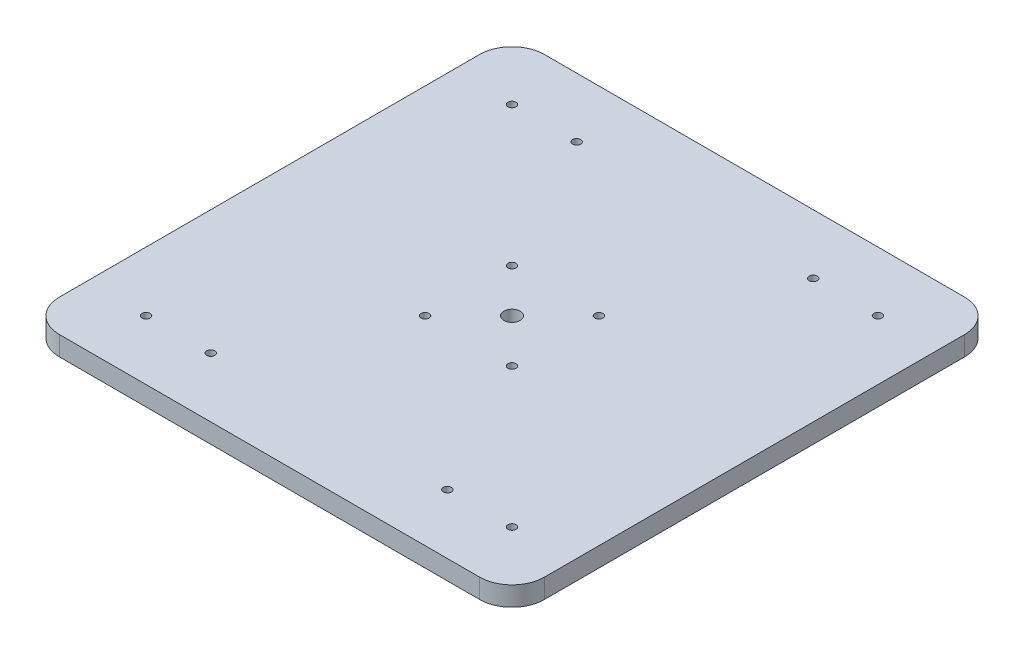
ISO-10303-21;
HEADER;
FILE_DESCRIPTION(('STEP AP214'),'2;1');
FILE_NAME('part.step','',(''),(''),'','','');
FILE_SCHEMA(('AUTOMOTIVE_DESIGN { 1 0 10303 214 1 1 1 1 }'));
ENDSEC;
DATA;
#1=APPLICATION_CONTEXT('core data for automotive mechanical design processes');
#2=APPLICATION_PROTOCOL_DEFINITION('international standard','automotive_design',2000,#1);
#3=PRODUCT_CONTEXT('',#1,'mechanical');
#4=PRODUCT('Part','Part','',(#3));
#5=PRODUCT_RELATED_PRODUCT_CATEGORY('part','',(#4));
#6=PRODUCT_DEFINITION_FORMATION('','',#4);
#7=PRODUCT_DEFINITION_CONTEXT('part definition',#1,'design');
#8=PRODUCT_DEFINITION('design','',#6,#7);
#9=PRODUCT_DEFINITION_SHAPE('','',#8);
#10=(LENGTH_UNIT() NAMED_UNIT(*) SI_UNIT(.MILLI.,.METRE.));
#11=(NAMED_UNIT(*) PLANE_ANGLE_UNIT() SI_UNIT($,.RADIAN.));
#12=(NAMED_UNIT(*) SI_UNIT($,.STERADIAN.) SOLID_ANGLE_UNIT());
#13=UNCERTAINTY_MEASURE_WITH_UNIT(LENGTH_MEASURE(1.E-05),#10,'distance_accuracy_value','');
#14=(GEOMETRIC_REPRESENTATION_CONTEXT(3) GLOBAL_UNCERTAINTY_ASSIGNED_CONTEXT((#13)) GLOBAL_UNIT_ASSIGNED_CONTEXT((#10,
#11,#12)) REPRESENTATION_CONTEXT('',''));
#15=CARTESIAN_POINT('',(0.,0.,0.));
#16=DIRECTION('',(0.,0.,1.));
#17=DIRECTION('',(1.,0.,0.));
#18=AXIS2_PLACEMENT_3D('',#15,#16,#17);
#19=CARTESIAN_POINT('',(75.,6.,-75.));
#20=DIRECTION('',(-1.,0.,0.));
#21=DIRECTION('',(0.,0.,1.));
#22=AXIS2_PLACEMENT_3D('',#19,#20,#21);
#23=PLANE('',#22);
#24=DIRECTION('',(0.,0.,-1.));
#25=VECTOR('',#24,1.);
#26=CARTESIAN_POINT('',(75.,6.,-75.));
#27=LINE('',#26,#25);
#28=CARTESIAN_POINT('',(75.,6.,65.));
#29=VERTEX_POINT('',#28);
#30=CARTESIAN_POINT('',(75.,6.,-65.));
#31=VERTEX_POINT('',#30);
#32=EDGE_CURVE('E147',#29,#31,#27,.T.);
#33=ORIENTED_EDGE('',*,*,#32,.F.);
#34=DIRECTION('',(0.,-1.,0.));
#35=VECTOR('',#34,1.);
#36=CARTESIAN_POINT('',(75.,6.,65.));
#37=LINE('',#36,#35);
#38=CARTESIAN_POINT('',(75.,0.,65.));
#39=VERTEX_POINT('',#38);
#40=EDGE_CURVE('E187',#29,#39,#37,.T.);
#41=ORIENTED_EDGE('',*,*,#40,.T.);
#42=DIRECTION('',(0.,0.,-1.));
#43=VECTOR('',#42,1.);
#44=CARTESIAN_POINT('',(75.,0.,-75.));
#45=LINE('',#44,#43);
#46=CARTESIAN_POINT('',(75.,0.,-65.));
#47=VERTEX_POINT('',#46);
#48=EDGE_CURVE('E212',#39,#47,#45,.T.);
#49=ORIENTED_EDGE('',*,*,#48,.T.);
#50=DIRECTION('',(0.,-1.,0.));
#51=VECTOR('',#50,1.);
#52=CARTESIAN_POINT('',(75.,6.,-65.));
#53=LINE('',#52,#51);
#54=EDGE_CURVE('E184',#47,#31,#53,.F.);
#55=ORIENTED_EDGE('',*,*,#54,.T.);
#56=EDGE_LOOP('',(#33,#41,#49,#55));
#57=FACE_BOUND('',#56,.T.);
#58=ADVANCED_FACE('F51',(#57),#23,.F.);
#59=CARTESIAN_POINT('',(-75.,6.,-75.));
#60=DIRECTION('',(0.,0.,1.));
#61=DIRECTION('',(1.,0.,0.));
#62=AXIS2_PLACEMENT_3D('',#59,#60,#61);
#63=PLANE('',#62);
#64=DIRECTION('',(-1.,0.,0.));
#65=VECTOR('',#64,1.);
#66=CARTESIAN_POINT('',(-75.,6.,-75.));
#67=LINE('',#66,#65);
#68=CARTESIAN_POINT('',(65.,6.,-75.));
#69=VERTEX_POINT('',#68);
#70=CARTESIAN_POINT('',(-65.,6.,-75.));
#71=VERTEX_POINT('',#70);
#72=EDGE_CURVE('E152',#69,#71,#67,.T.);
#73=ORIENTED_EDGE('',*,*,#72,.F.);
#74=DIRECTION('',(0.,-1.,0.));
#75=VECTOR('',#74,1.);
#76=CARTESIAN_POINT('',(65.,6.,-75.));
#77=LINE('',#76,#75);
#78=CARTESIAN_POINT('',(65.,0.,-75.));
#79=VERTEX_POINT('',#78);
#80=EDGE_CURVE('E11',#69,#79,#77,.T.);
#81=ORIENTED_EDGE('',*,*,#80,.T.);
#82=DIRECTION('',(-1.,0.,0.));
#83=VECTOR('',#82,1.);
#84=CARTESIAN_POINT('',(-75.,0.,-75.));
#85=LINE('',#84,#83);
#86=CARTESIAN_POINT('',(-65.,0.,-75.));
#87=VERTEX_POINT('',#86);
#88=EDGE_CURVE('E155',#79,#87,#85,.T.);
#89=ORIENTED_EDGE('',*,*,#88,.T.);
#90=DIRECTION('',(0.,-1.,0.));
#91=VECTOR('',#90,1.);
#92=CARTESIAN_POINT('',(-65.,6.,-75.));
#93=LINE('',#92,#91);
#94=EDGE_CURVE('E60',#87,#71,#93,.F.);
#95=ORIENTED_EDGE('',*,*,#94,.T.);
#96=EDGE_LOOP('',(#73,#81,#89,#95));
#97=FACE_BOUND('',#96,.T.);
#98=ADVANCED_FACE('F356',(#97),#63,.F.);
#99=CARTESIAN_POINT('',(-75.,6.,-75.));
#100=DIRECTION('',(1.,0.,0.));
#101=DIRECTION('',(0.,0.,-1.));
#102=AXIS2_PLACEMENT_3D('',#99,#100,#101);
#103=PLANE('',#102);
#104=DIRECTION('',(0.,0.,1.));
#105=VECTOR('',#104,1.);
#106=CARTESIAN_POINT('',(-75.,0.,-75.));
#107=LINE('',#106,#105);
#108=CARTESIAN_POINT('',(-75.,0.,-65.));
#109=VERTEX_POINT('',#108);
#110=CARTESIAN_POINT('',(-75.,0.,65.));
#111=VERTEX_POINT('',#110);
#112=EDGE_CURVE('E148',#109,#111,#107,.T.);
#113=ORIENTED_EDGE('',*,*,#112,.T.);
#114=DIRECTION('',(0.,-1.,0.));
#115=VECTOR('',#114,1.);
#116=CARTESIAN_POINT('',(-75.,6.,65.));
#117=LINE('',#116,#115);
#118=CARTESIAN_POINT('',(-75.,6.,65.));
#119=VERTEX_POINT('',#118);
#120=EDGE_CURVE('E123',#111,#119,#117,.F.);
#121=ORIENTED_EDGE('',*,*,#120,.T.);
#122=DIRECTION('',(0.,0.,1.));
#123=VECTOR('',#122,1.);
#124=CARTESIAN_POINT('',(-75.,6.,-75.));
#125=LINE('',#124,#123);
#126=CARTESIAN_POINT('',(-75.,6.,-65.));
#127=VERTEX_POINT('',#126);
#128=EDGE_CURVE('E255',#127,#119,#125,.T.);
#129=ORIENTED_EDGE('',*,*,#128,.F.);
#130=DIRECTION('',(0.,-1.,0.));
#131=VECTOR('',#130,1.);
#132=CARTESIAN_POINT('',(-75.,6.,-65.));
#133=LINE('',#132,#131);
#134=EDGE_CURVE('E129',#127,#109,#133,.T.);
#135=ORIENTED_EDGE('',*,*,#134,.T.);
#136=EDGE_LOOP('',(#113,#121,#129,#135));
#137=FACE_BOUND('',#136,.T.);
#138=ADVANCED_FACE('F361',(#137),#103,.F.);
#139=CARTESIAN_POINT('',(-75.,6.,75.));
#140=DIRECTION('',(0.,0.,-1.));
#141=DIRECTION('',(-1.,0.,0.));
#142=AXIS2_PLACEMENT_3D('',#139,#140,#141);
#143=PLANE('',#142);
#144=DIRECTION('',(1.,0.,0.));
#145=VECTOR('',#144,1.);
#146=CARTESIAN_POINT('',(-75.,6.,75.));
#147=LINE('',#146,#145);
#148=CARTESIAN_POINT('',(-65.,6.,75.));
#149=VERTEX_POINT('',#148);
#150=CARTESIAN_POINT('',(65.,6.,75.));
#151=VERTEX_POINT('',#150);
#152=EDGE_CURVE('E139',#149,#151,#147,.T.);
#153=ORIENTED_EDGE('',*,*,#152,.F.);
#154=DIRECTION('',(0.,-1.,0.));
#155=VECTOR('',#154,1.);
#156=CARTESIAN_POINT('',(-65.,6.,75.));
#157=LINE('',#156,#155);
#158=CARTESIAN_POINT('',(-65.,0.,75.));
#159=VERTEX_POINT('',#158);
#160=EDGE_CURVE('E122',#149,#159,#157,.T.);
#161=ORIENTED_EDGE('',*,*,#160,.T.);
#162=DIRECTION('',(1.,0.,0.));
#163=VECTOR('',#162,1.);
#164=CARTESIAN_POINT('',(-75.,0.,75.));
#165=LINE('',#164,#163);
#166=CARTESIAN_POINT('',(65.,0.,75.));
#167=VERTEX_POINT('',#166);
#168=EDGE_CURVE('E136',#159,#167,#165,.T.);
#169=ORIENTED_EDGE('',*,*,#168,.T.);
#170=DIRECTION('',(0.,-1.,0.));
#171=VECTOR('',#170,1.);
#172=CARTESIAN_POINT('',(65.,6.,75.));
#173=LINE('',#172,#171);
#174=EDGE_CURVE('E142',#167,#151,#173,.F.);
#175=ORIENTED_EDGE('',*,*,#174,.T.);
#176=EDGE_LOOP('',(#153,#161,#169,#175));
#177=FACE_BOUND('',#176,.T.);
#178=ADVANCED_FACE('F135',(#177),#143,.F.);
#179=CARTESIAN_POINT('',(0.,6.,0.));
#180=DIRECTION('',(0.,1.,0.));
#181=DIRECTION('',(0.,0.,1.));
#182=AXIS2_PLACEMENT_3D('',#179,#180,#181);
#183=PLANE('',#182);
#184=CARTESIAN_POINT('',(0.,6.,0.));
#185=DIRECTION('',(0.,1.,0.));
#186=DIRECTION('',(0.,0.,1.));
#187=AXIS2_PLACEMENT_3D('',#184,#185,#186);
#188=CIRCLE('',#187,2.5);
#189=CARTESIAN_POINT('',(0.,6.,2.5));
#190=VERTEX_POINT('',#189);
#191=EDGE_CURVE('E301',#190,#190,#188,.T.);
#192=ORIENTED_EDGE('',*,*,#191,.F.);
#193=EDGE_LOOP('',(#192));
#194=FACE_BOUND('',#193,.T.);
#195=CARTESIAN_POINT('',(-13.4350288425443,6.,13.4350288425445));
#196=DIRECTION('',(0.,1.,0.));
#197=DIRECTION('',(0.,0.,1.));
#198=AXIS2_PLACEMENT_3D('',#195,#196,#197);
#199=CIRCLE('',#198,1.25);
#200=CARTESIAN_POINT('',(-13.4350288425443,6.,14.6850288425445));
#201=VERTEX_POINT('',#200);
#202=EDGE_CURVE('E229',#201,#201,#199,.T.);
#203=ORIENTED_EDGE('',*,*,#202,.F.);
#204=EDGE_LOOP('',(#203));
#205=FACE_BOUND('',#204,.T.);
#206=CARTESIAN_POINT('',(-13.4350288425445,6.,-13.4350288425443));
#207=DIRECTION('',(0.,1.,0.));
#208=DIRECTION('',(0.,0.,1.));
#209=AXIS2_PLACEMENT_3D('',#206,#207,#208);
#210=CIRCLE('',#209,1.25);
#211=CARTESIAN_POINT('',(-13.4350288425445,6.,-12.1850288425443));
#212=VERTEX_POINT('',#211);
#213=EDGE_CURVE('E232',#212,#212,#210,.T.);
#214=ORIENTED_EDGE('',*,*,#213,.F.);
#215=EDGE_LOOP('',(#214));
#216=FACE_BOUND('',#215,.T.);
#217=CARTESIAN_POINT('',(13.4350288425444,6.,-13.4350288425444));
#218=DIRECTION('',(0.,1.,0.));
#219=DIRECTION('',(0.,0.,1.));
#220=AXIS2_PLACEMENT_3D('',#217,#218,#219);
#221=CIRCLE('',#220,1.25);
#222=CARTESIAN_POINT('',(13.4350288425444,6.,-12.1850288425444));
#223=VERTEX_POINT('',#222);
#224=EDGE_CURVE('E195',#223,#223,#221,.T.);
#225=ORIENTED_EDGE('',*,*,#224,.F.);
#226=EDGE_LOOP('',(#225));
#227=FACE_BOUND('',#226,.T.);
#228=CARTESIAN_POINT('',(13.4350288425444,6.,13.4350288425444));
#229=DIRECTION('',(0.,1.,0.));
#230=DIRECTION('',(0.,0.,1.));
#231=AXIS2_PLACEMENT_3D('',#228,#229,#230);
#232=CIRCLE('',#231,1.25);
#233=CARTESIAN_POINT('',(13.4350288425444,6.,14.6850288425444));
#234=VERTEX_POINT('',#233);
#235=EDGE_CURVE('E193',#234,#234,#232,.T.);
#236=ORIENTED_EDGE('',*,*,#235,.F.);
#237=EDGE_LOOP('',(#236));
#238=FACE_BOUND('',#237,.T.);
#239=CARTESIAN_POINT('',(36.5685424949238,6.,56.5685424949237));
#240=DIRECTION('',(0.,1.,0.));
#241=DIRECTION('',(0.,0.,1.));
#242=AXIS2_PLACEMENT_3D('',#239,#240,#241);
#243=CIRCLE('',#242,1.25);
#244=CARTESIAN_POINT('',(36.5685424949238,6.,57.8185424949237));
#245=VERTEX_POINT('',#244);
#246=EDGE_CURVE('E217',#245,#245,#243,.T.);
#247=ORIENTED_EDGE('',*,*,#246,.F.);
#248=EDGE_LOOP('',(#247));
#249=FACE_BOUND('',#248,.T.);
#250=CARTESIAN_POINT('',(-36.5933251339775,6.,-56.5933251339774));
#251=DIRECTION('',(0.,1.,0.));
#252=DIRECTION('',(0.,0.,1.));
#253=AXIS2_PLACEMENT_3D('',#250,#251,#252);
#254=CIRCLE('',#253,1.25);
#255=CARTESIAN_POINT('',(-36.5933251339775,6.,-55.3433251339774));
#256=VERTEX_POINT('',#255);
#257=EDGE_CURVE('E277',#256,#256,#254,.T.);
#258=ORIENTED_EDGE('',*,*,#257,.F.);
#259=EDGE_LOOP('',(#258));
#260=FACE_BOUND('',#259,.T.);
#261=CARTESIAN_POINT('',(36.5685424949244,6.,-56.593325133977));
#262=DIRECTION('',(0.,1.,0.));
#263=DIRECTION('',(0.,0.,1.));
#264=AXIS2_PLACEMENT_3D('',#261,#262,#263);
#265=CIRCLE('',#264,1.25);
#266=CARTESIAN_POINT('',(36.5685424949244,6.,-55.343325133977));
#267=VERTEX_POINT('',#266);
#268=EDGE_CURVE('E226',#267,#267,#265,.T.);
#269=ORIENTED_EDGE('',*,*,#268,.F.);
#270=EDGE_LOOP('',(#269));
#271=FACE_BOUND('',#270,.T.);
#272=CARTESIAN_POINT('',(-36.5933251339776,6.,56.5685424949236));
#273=DIRECTION('',(0.,1.,0.));
#274=DIRECTION('',(0.,0.,1.));
#275=AXIS2_PLACEMENT_3D('',#272,#273,#274);
#276=CIRCLE('',#275,1.25);
#277=CARTESIAN_POINT('',(-36.5933251339776,6.,57.8185424949236));
#278=VERTEX_POINT('',#277);
#279=EDGE_CURVE('E223',#278,#278,#276,.T.);
#280=ORIENTED_EDGE('',*,*,#279,.F.);
#281=EDGE_LOOP('',(#280));
#282=FACE_BOUND('',#281,.T.);
#283=CARTESIAN_POINT('',(-56.5933251339776,6.,56.5685424949236));
#284=DIRECTION('',(0.,-1.,0.));
#285=DIRECTION('',(1.,0.,0.));
#286=AXIS2_PLACEMENT_3D('',#283,#284,#285);
#287=CIRCLE('',#286,1.25);
#288=CARTESIAN_POINT('',(-55.3433251339776,6.,56.5685424949236));
#289=VERTEX_POINT('',#288);
#290=EDGE_CURVE('E205',#289,#289,#287,.T.);
#291=ORIENTED_EDGE('',*,*,#290,.T.);
#292=EDGE_LOOP('',(#291));
#293=FACE_BOUND('',#292,.T.);
#294=CARTESIAN_POINT('',(-56.5933251339775,6.,-56.5933251339774));
#295=DIRECTION('',(0.,-1.,0.));
#296=DIRECTION('',(0.,0.,1.));
#297=AXIS2_PLACEMENT_3D('',#294,#295,#296);
#298=CIRCLE('',#297,1.25);
#299=CARTESIAN_POINT('',(-56.5933251339775,6.,-55.3433251339774));
#300=VERTEX_POINT('',#299);
#301=EDGE_CURVE('E242',#300,#300,#298,.T.);
#302=ORIENTED_EDGE('',*,*,#301,.T.);
#303=EDGE_LOOP('',(#302));
#304=FACE_BOUND('',#303,.T.);
#305=CARTESIAN_POINT('',(56.5685424949244,6.,-56.5933251339768));
#306=DIRECTION('',(0.,-1.,0.));
#307=DIRECTION('',(-1.,0.,0.));
#308=AXIS2_PLACEMENT_3D('',#305,#306,#307);
#309=CIRCLE('',#308,1.25);
#310=CARTESIAN_POINT('',(55.3185424949244,6.,-56.5933251339768));
#311=VERTEX_POINT('',#310);
#312=EDGE_CURVE('E216',#311,#311,#309,.T.);
#313=ORIENTED_EDGE('',*,*,#312,.T.);
#314=EDGE_LOOP('',(#313));
#315=FACE_BOUND('',#314,.T.);
#316=CARTESIAN_POINT('',(56.5685424949238,6.,56.5685424949238));
#317=DIRECTION('',(0.,-1.,0.));
#318=DIRECTION('',(0.,0.,-1.));
#319=AXIS2_PLACEMENT_3D('',#316,#317,#318);
#320=CIRCLE('',#319,1.25);
#321=CARTESIAN_POINT('',(56.5685424949238,6.,55.3185424949238));
#322=VERTEX_POINT('',#321);
#323=EDGE_CURVE('E219',#322,#322,#320,.T.);
#324=ORIENTED_EDGE('',*,*,#323,.T.);
#325=EDGE_LOOP('',(#324));
#326=FACE_BOUND('',#325,.T.);
#327=ORIENTED_EDGE('',*,*,#128,.T.);
#328=CARTESIAN_POINT('',(-65.,6.,65.));
#329=DIRECTION('',(0.,1.,0.));
#330=DIRECTION('',(0.,0.,1.));
#331=AXIS2_PLACEMENT_3D('',#328,#329,#330);
#332=CIRCLE('',#331,10.);
#333=EDGE_CURVE('E181',#119,#149,#332,.T.);
#334=ORIENTED_EDGE('',*,*,#333,.T.);
#335=ORIENTED_EDGE('',*,*,#152,.T.);
#336=CARTESIAN_POINT('',(65.,6.,65.));
#337=DIRECTION('',(0.,1.,0.));
#338=DIRECTION('',(0.,0.,1.));
#339=AXIS2_PLACEMENT_3D('',#336,#337,#338);
#340=CIRCLE('',#339,10.);
#341=EDGE_CURVE('E178',#151,#29,#340,.T.);
#342=ORIENTED_EDGE('',*,*,#341,.T.);
#343=ORIENTED_EDGE('',*,*,#32,.T.);
#344=CARTESIAN_POINT('',(65.,6.,-65.));
#345=DIRECTION('',(0.,1.,0.));
#346=DIRECTION('',(0.,0.,1.));
#347=AXIS2_PLACEMENT_3D('',#344,#345,#346);
#348=CIRCLE('',#347,10.);
#349=EDGE_CURVE('E73',#31,#69,#348,.T.);
#350=ORIENTED_EDGE('',*,*,#349,.T.);
#351=ORIENTED_EDGE('',*,*,#72,.T.);
#352=CARTESIAN_POINT('',(-65.,6.,-65.));
#353=DIRECTION('',(0.,1.,0.));
#354=DIRECTION('',(0.,0.,1.));
#355=AXIS2_PLACEMENT_3D('',#352,#353,#354);
#356=CIRCLE('',#355,10.);
#357=EDGE_CURVE('E173',#71,#127,#356,.T.);
#358=ORIENTED_EDGE('',*,*,#357,.T.);
#359=EDGE_LOOP('',(#327,#334,#335,#342,#343,#350,#351,#358));
#360=FACE_BOUND('',#359,.T.);
#361=ADVANCED_FACE('F313',(#194,#205,#216,#227,#238,#249,#260,#271,#282,#293,#304,#315,#326,
#360),#183,.T.);
#362=CARTESIAN_POINT('',(0.,0.,0.));
#363=DIRECTION('',(0.,1.,0.));
#364=DIRECTION('',(0.,0.,1.));
#365=AXIS2_PLACEMENT_3D('',#362,#363,#364);
#366=PLANE('',#365);
#367=CARTESIAN_POINT('',(0.,0.,0.));
#368=DIRECTION('',(0.,-1.,0.));
#369=DIRECTION('',(0.,0.,-1.));
#370=AXIS2_PLACEMENT_3D('',#367,#368,#369);
#371=CIRCLE('',#370,2.5);
#372=CARTESIAN_POINT('',(0.,0.,-2.5));
#373=VERTEX_POINT('',#372);
#374=EDGE_CURVE('E305',#373,#373,#371,.T.);
#375=ORIENTED_EDGE('',*,*,#374,.F.);
#376=EDGE_LOOP('',(#375));
#377=FACE_BOUND('',#376,.T.);
#378=CARTESIAN_POINT('',(-13.4350288425443,0.,13.4350288425445));
#379=DIRECTION('',(0.,-1.,0.));
#380=DIRECTION('',(0.,0.,-1.));
#381=AXIS2_PLACEMENT_3D('',#378,#379,#380);
#382=CIRCLE('',#381,1.25);
#383=CARTESIAN_POINT('',(-13.4350288425443,0.,12.1850288425445));
#384=VERTEX_POINT('',#383);
#385=EDGE_CURVE('E202',#384,#384,#382,.T.);
#386=ORIENTED_EDGE('',*,*,#385,.F.);
#387=EDGE_LOOP('',(#386));
#388=FACE_BOUND('',#387,.T.);
#389=CARTESIAN_POINT('',(-13.4350288425445,0.,-13.4350288425443));
#390=DIRECTION('',(0.,-1.,0.));
#391=DIRECTION('',(0.,0.,-1.));
#392=AXIS2_PLACEMENT_3D('',#389,#390,#391);
#393=CIRCLE('',#392,1.25);
#394=CARTESIAN_POINT('',(-13.4350288425445,0.,-14.6850288425443));
#395=VERTEX_POINT('',#394);
#396=EDGE_CURVE('E199',#395,#395,#393,.T.);
#397=ORIENTED_EDGE('',*,*,#396,.F.);
#398=EDGE_LOOP('',(#397));
#399=FACE_BOUND('',#398,.T.);
#400=CARTESIAN_POINT('',(13.4350288425444,0.,-13.4350288425444));
#401=DIRECTION('',(0.,-1.,0.));
#402=DIRECTION('',(0.,0.,-1.));
#403=AXIS2_PLACEMENT_3D('',#400,#401,#402);
#404=CIRCLE('',#403,1.25);
#405=CARTESIAN_POINT('',(13.4350288425444,0.,-14.6850288425444));
#406=VERTEX_POINT('',#405);
#407=EDGE_CURVE('E201',#406,#406,#404,.T.);
#408=ORIENTED_EDGE('',*,*,#407,.F.);
#409=EDGE_LOOP('',(#408));
#410=FACE_BOUND('',#409,.T.);
#411=CARTESIAN_POINT('',(13.4350288425444,0.,13.4350288425444));
#412=DIRECTION('',(0.,-1.,0.));
#413=DIRECTION('',(0.,0.,-1.));
#414=AXIS2_PLACEMENT_3D('',#411,#412,#413);
#415=CIRCLE('',#414,1.25);
#416=CARTESIAN_POINT('',(13.4350288425444,0.,12.1850288425444));
#417=VERTEX_POINT('',#416);
#418=EDGE_CURVE('E196',#417,#417,#415,.T.);
#419=ORIENTED_EDGE('',*,*,#418,.F.);
#420=EDGE_LOOP('',(#419));
#421=FACE_BOUND('',#420,.T.);
#422=CARTESIAN_POINT('',(36.5685424949238,0.,56.5685424949237));
#423=DIRECTION('',(0.,-1.,0.));
#424=DIRECTION('',(0.,0.,-1.));
#425=AXIS2_PLACEMENT_3D('',#422,#423,#424);
#426=CIRCLE('',#425,1.25);
#427=CARTESIAN_POINT('',(36.5685424949238,0.,55.3185424949237));
#428=VERTEX_POINT('',#427);
#429=EDGE_CURVE('E287',#428,#428,#426,.T.);
#430=ORIENTED_EDGE('',*,*,#429,.F.);
#431=EDGE_LOOP('',(#430));
#432=FACE_BOUND('',#431,.T.);
#433=CARTESIAN_POINT('',(-36.5933251339775,0.,-56.5933251339774));
#434=DIRECTION('',(0.,-1.,0.));
#435=DIRECTION('',(0.,0.,-1.));
#436=AXIS2_PLACEMENT_3D('',#433,#434,#435);
#437=CIRCLE('',#436,1.25);
#438=CARTESIAN_POINT('',(-36.5933251339775,0.,-57.8433251339774));
#439=VERTEX_POINT('',#438);
#440=EDGE_CURVE('E288',#439,#439,#437,.T.);
#441=ORIENTED_EDGE('',*,*,#440,.F.);
#442=EDGE_LOOP('',(#441));
#443=FACE_BOUND('',#442,.T.);
#444=CARTESIAN_POINT('',(36.5685424949244,0.,-56.593325133977));
#445=DIRECTION('',(0.,-1.,0.));
#446=DIRECTION('',(0.,0.,-1.));
#447=AXIS2_PLACEMENT_3D('',#444,#445,#446);
#448=CIRCLE('',#447,1.25);
#449=CARTESIAN_POINT('',(36.5685424949244,0.,-57.843325133977));
#450=VERTEX_POINT('',#449);
#451=EDGE_CURVE('E231',#450,#450,#448,.T.);
#452=ORIENTED_EDGE('',*,*,#451,.F.);
#453=EDGE_LOOP('',(#452));
#454=FACE_BOUND('',#453,.T.);
#455=CARTESIAN_POINT('',(-36.5933251339776,0.,56.5685424949236));
#456=DIRECTION('',(0.,-1.,0.));
#457=DIRECTION('',(0.,0.,-1.));
#458=AXIS2_PLACEMENT_3D('',#455,#456,#457);
#459=CIRCLE('',#458,1.25);
#460=CARTESIAN_POINT('',(-36.5933251339776,0.,55.3185424949236));
#461=VERTEX_POINT('',#460);
#462=EDGE_CURVE('E227',#461,#461,#459,.T.);
#463=ORIENTED_EDGE('',*,*,#462,.F.);
#464=EDGE_LOOP('',(#463));
#465=FACE_BOUND('',#464,.T.);
#466=CARTESIAN_POINT('',(-56.5933251339776,0.,56.5685424949236));
#467=DIRECTION('',(0.,-1.,0.));
#468=DIRECTION('',(1.,0.,0.));
#469=AXIS2_PLACEMENT_3D('',#466,#467,#468);
#470=CIRCLE('',#469,1.25);
#471=CARTESIAN_POINT('',(-55.3433251339776,0.,56.5685424949236));
#472=VERTEX_POINT('',#471);
#473=EDGE_CURVE('E209',#472,#472,#470,.T.);
#474=ORIENTED_EDGE('',*,*,#473,.F.);
#475=EDGE_LOOP('',(#474));
#476=FACE_BOUND('',#475,.T.);
#477=CARTESIAN_POINT('',(-56.5933251339775,0.,-56.5933251339774));
#478=DIRECTION('',(0.,-1.,0.));
#479=DIRECTION('',(0.,0.,1.));
#480=AXIS2_PLACEMENT_3D('',#477,#478,#479);
#481=CIRCLE('',#480,1.25);
#482=CARTESIAN_POINT('',(-56.5933251339775,0.,-55.3433251339774));
#483=VERTEX_POINT('',#482);
#484=EDGE_CURVE('E267',#483,#483,#481,.T.);
#485=ORIENTED_EDGE('',*,*,#484,.F.);
#486=EDGE_LOOP('',(#485));
#487=FACE_BOUND('',#486,.T.);
#488=CARTESIAN_POINT('',(56.5685424949244,0.,-56.5933251339768));
#489=DIRECTION('',(0.,-1.,0.));
#490=DIRECTION('',(-1.,0.,0.));
#491=AXIS2_PLACEMENT_3D('',#488,#489,#490);
#492=CIRCLE('',#491,1.25);
#493=CARTESIAN_POINT('',(55.3185424949244,0.,-56.5933251339768));
#494=VERTEX_POINT('',#493);
#495=EDGE_CURVE('E213',#494,#494,#492,.T.);
#496=ORIENTED_EDGE('',*,*,#495,.F.);
#497=EDGE_LOOP('',(#496));
#498=FACE_BOUND('',#497,.T.);
#499=CARTESIAN_POINT('',(56.5685424949238,0.,56.5685424949238));
#500=DIRECTION('',(0.,-1.,0.));
#501=DIRECTION('',(0.,0.,-1.));
#502=AXIS2_PLACEMENT_3D('',#499,#500,#501);
#503=CIRCLE('',#502,1.25);
#504=CARTESIAN_POINT('',(56.5685424949238,0.,55.3185424949238));
#505=VERTEX_POINT('',#504);
#506=EDGE_CURVE('E208',#505,#505,#503,.T.);
#507=ORIENTED_EDGE('',*,*,#506,.F.);
#508=EDGE_LOOP('',(#507));
#509=FACE_BOUND('',#508,.T.);
#510=ORIENTED_EDGE('',*,*,#168,.F.);
#511=CARTESIAN_POINT('',(-65.,0.,65.));
#512=DIRECTION('',(0.,1.,0.));
#513=DIRECTION('',(0.,0.,1.));
#514=AXIS2_PLACEMENT_3D('',#511,#512,#513);
#515=CIRCLE('',#514,10.);
#516=EDGE_CURVE('E118',#159,#111,#515,.F.);
#517=ORIENTED_EDGE('',*,*,#516,.T.);
#518=ORIENTED_EDGE('',*,*,#112,.F.);
#519=CARTESIAN_POINT('',(-65.,0.,-65.));
#520=DIRECTION('',(0.,1.,0.));
#521=DIRECTION('',(0.,0.,1.));
#522=AXIS2_PLACEMENT_3D('',#519,#520,#521);
#523=CIRCLE('',#522,10.);
#524=EDGE_CURVE('E141',#109,#87,#523,.F.);
#525=ORIENTED_EDGE('',*,*,#524,.T.);
#526=ORIENTED_EDGE('',*,*,#88,.F.);
#527=CARTESIAN_POINT('',(65.,0.,-65.));
#528=DIRECTION('',(0.,1.,0.));
#529=DIRECTION('',(0.,0.,1.));
#530=AXIS2_PLACEMENT_3D('',#527,#528,#529);
#531=CIRCLE('',#530,10.);
#532=EDGE_CURVE('E163',#79,#47,#531,.F.);
#533=ORIENTED_EDGE('',*,*,#532,.T.);
#534=ORIENTED_EDGE('',*,*,#48,.F.);
#535=CARTESIAN_POINT('',(65.,0.,65.));
#536=DIRECTION('',(0.,1.,0.));
#537=DIRECTION('',(0.,0.,1.));
#538=AXIS2_PLACEMENT_3D('',#535,#536,#537);
#539=CIRCLE('',#538,10.);
#540=EDGE_CURVE('E130',#39,#167,#539,.F.);
#541=ORIENTED_EDGE('',*,*,#540,.T.);
#542=EDGE_LOOP('',(#510,#517,#518,#525,#526,#533,#534,#541));
#543=FACE_BOUND('',#542,.T.);
#544=ADVANCED_FACE('F144',(#377,#388,#399,#410,#421,#432,#443,#454,#465,#476,#487,#498,#509,
#543),#366,.F.);
#545=CARTESIAN_POINT('',(-65.,6.,65.));
#546=DIRECTION('',(0.,-1.,0.));
#547=DIRECTION('',(0.,0.,-1.));
#548=AXIS2_PLACEMENT_3D('',#545,#546,#547);
#549=CYLINDRICAL_SURFACE('',#548,10.);
#550=ORIENTED_EDGE('',*,*,#333,.F.);
#551=ORIENTED_EDGE('',*,*,#120,.F.);
#552=ORIENTED_EDGE('',*,*,#516,.F.);
#553=ORIENTED_EDGE('',*,*,#160,.F.);
#554=EDGE_LOOP('',(#550,#551,#552,#553));
#555=FACE_BOUND('',#554,.T.);
#556=ADVANCED_FACE('F121',(#555),#549,.T.);
#557=CARTESIAN_POINT('',(65.,6.,65.));
#558=DIRECTION('',(0.,-1.,0.));
#559=DIRECTION('',(0.,0.,-1.));
#560=AXIS2_PLACEMENT_3D('',#557,#558,#559);
#561=CYLINDRICAL_SURFACE('',#560,10.);
#562=ORIENTED_EDGE('',*,*,#341,.F.);
#563=ORIENTED_EDGE('',*,*,#174,.F.);
#564=ORIENTED_EDGE('',*,*,#540,.F.);
#565=ORIENTED_EDGE('',*,*,#40,.F.);
#566=EDGE_LOOP('',(#562,#563,#564,#565));
#567=FACE_BOUND('',#566,.T.);
#568=ADVANCED_FACE('F368',(#567),#561,.T.);
#569=CARTESIAN_POINT('',(65.,6.,-65.));
#570=DIRECTION('',(0.,-1.,0.));
#571=DIRECTION('',(0.,0.,-1.));
#572=AXIS2_PLACEMENT_3D('',#569,#570,#571);
#573=CYLINDRICAL_SURFACE('',#572,10.);
#574=ORIENTED_EDGE('',*,*,#349,.F.);
#575=ORIENTED_EDGE('',*,*,#54,.F.);
#576=ORIENTED_EDGE('',*,*,#532,.F.);
#577=ORIENTED_EDGE('',*,*,#80,.F.);
#578=EDGE_LOOP('',(#574,#575,#576,#577));
#579=FACE_BOUND('',#578,.T.);
#580=ADVANCED_FACE('F351',(#579),#573,.T.);
#581=CARTESIAN_POINT('',(-65.,6.,-65.));
#582=DIRECTION('',(0.,-1.,0.));
#583=DIRECTION('',(0.,0.,-1.));
#584=AXIS2_PLACEMENT_3D('',#581,#582,#583);
#585=CYLINDRICAL_SURFACE('',#584,10.);
#586=ORIENTED_EDGE('',*,*,#357,.F.);
#587=ORIENTED_EDGE('',*,*,#94,.F.);
#588=ORIENTED_EDGE('',*,*,#524,.F.);
#589=ORIENTED_EDGE('',*,*,#134,.F.);
#590=EDGE_LOOP('',(#586,#587,#588,#589));
#591=FACE_BOUND('',#590,.T.);
#592=ADVANCED_FACE('F53',(#591),#585,.T.);
#593=CARTESIAN_POINT('',(56.5685424949238,6.,56.5685424949238));
#594=DIRECTION('',(0.,-1.,0.));
#595=DIRECTION('',(0.,0.,-1.));
#596=AXIS2_PLACEMENT_3D('',#593,#594,#595);
#597=CYLINDRICAL_SURFACE('',#596,1.25);
#598=ORIENTED_EDGE('',*,*,#323,.F.);
#599=EDGE_LOOP('',(#598));
#600=FACE_BOUND('',#599,.T.);
#601=ORIENTED_EDGE('',*,*,#506,.T.);
#602=EDGE_LOOP('',(#601));
#603=FACE_BOUND('',#602,.T.);
#604=ADVANCED_FACE('F339',(#600,#603),#597,.F.);
#605=CARTESIAN_POINT('',(56.5685424949244,6.,-56.5933251339768));
#606=DIRECTION('',(0.,-1.,0.));
#607=DIRECTION('',(0.,0.,-1.));
#608=AXIS2_PLACEMENT_3D('',#605,#606,#607);
#609=CYLINDRICAL_SURFACE('',#608,1.25);
#610=ORIENTED_EDGE('',*,*,#312,.F.);
#611=EDGE_LOOP('',(#610));
#612=FACE_BOUND('',#611,.T.);
#613=ORIENTED_EDGE('',*,*,#495,.T.);
#614=EDGE_LOOP('',(#613));
#615=FACE_BOUND('',#614,.T.);
#616=ADVANCED_FACE('F341',(#612,#615),#609,.F.);
#617=CARTESIAN_POINT('',(-56.5933251339775,6.,-56.5933251339774));
#618=DIRECTION('',(0.,-1.,0.));
#619=DIRECTION('',(0.,0.,-1.));
#620=AXIS2_PLACEMENT_3D('',#617,#618,#619);
#621=CYLINDRICAL_SURFACE('',#620,1.25);
#622=ORIENTED_EDGE('',*,*,#301,.F.);
#623=EDGE_LOOP('',(#622));
#624=FACE_BOUND('',#623,.T.);
#625=ORIENTED_EDGE('',*,*,#484,.T.);
#626=EDGE_LOOP('',(#625));
#627=FACE_BOUND('',#626,.T.);
#628=ADVANCED_FACE('F348',(#624,#627),#621,.F.);
#629=CARTESIAN_POINT('',(-56.5933251339776,6.,56.5685424949236));
#630=DIRECTION('',(0.,-1.,0.));
#631=DIRECTION('',(0.,0.,-1.));
#632=AXIS2_PLACEMENT_3D('',#629,#630,#631);
#633=CYLINDRICAL_SURFACE('',#632,1.25);
#634=ORIENTED_EDGE('',*,*,#290,.F.);
#635=EDGE_LOOP('',(#634));
#636=FACE_BOUND('',#635,.T.);
#637=ORIENTED_EDGE('',*,*,#473,.T.);
#638=EDGE_LOOP('',(#637));
#639=FACE_BOUND('',#638,.T.);
#640=ADVANCED_FACE('F438',(#636,#639),#633,.F.);
#641=CARTESIAN_POINT('',(-36.5933251339776,10.,56.5685424949236));
#642=DIRECTION('',(0.,-1.,0.));
#643=DIRECTION('',(0.,0.,-1.));
#644=AXIS2_PLACEMENT_3D('',#641,#642,#643);
#645=CYLINDRICAL_SURFACE('',#644,1.25);
#646=ORIENTED_EDGE('',*,*,#279,.T.);
#647=EDGE_LOOP('',(#646));
#648=FACE_BOUND('',#647,.T.);
#649=ORIENTED_EDGE('',*,*,#462,.T.);
#650=EDGE_LOOP('',(#649));
#651=FACE_BOUND('',#650,.T.);
#652=ADVANCED_FACE('F447',(#648,#651),#645,.F.);
#653=CARTESIAN_POINT('',(36.5685424949244,10.,-56.593325133977));
#654=DIRECTION('',(0.,-1.,0.));
#655=DIRECTION('',(0.,0.,-1.));
#656=AXIS2_PLACEMENT_3D('',#653,#654,#655);
#657=CYLINDRICAL_SURFACE('',#656,1.25);
#658=ORIENTED_EDGE('',*,*,#268,.T.);
#659=EDGE_LOOP('',(#658));
#660=FACE_BOUND('',#659,.T.);
#661=ORIENTED_EDGE('',*,*,#451,.T.);
#662=EDGE_LOOP('',(#661));
#663=FACE_BOUND('',#662,.T.);
#664=ADVANCED_FACE('F456',(#660,#663),#657,.F.);
#665=CARTESIAN_POINT('',(-36.5933251339775,10.,-56.5933251339774));
#666=DIRECTION('',(0.,-1.,0.));
#667=DIRECTION('',(0.,0.,-1.));
#668=AXIS2_PLACEMENT_3D('',#665,#666,#667);
#669=CYLINDRICAL_SURFACE('',#668,1.25);
#670=ORIENTED_EDGE('',*,*,#257,.T.);
#671=EDGE_LOOP('',(#670));
#672=FACE_BOUND('',#671,.T.);
#673=ORIENTED_EDGE('',*,*,#440,.T.);
#674=EDGE_LOOP('',(#673));
#675=FACE_BOUND('',#674,.T.);
#676=ADVANCED_FACE('F465',(#672,#675),#669,.F.);
#677=CARTESIAN_POINT('',(36.5685424949238,10.,56.5685424949237));
#678=DIRECTION('',(0.,-1.,0.));
#679=DIRECTION('',(0.,0.,-1.));
#680=AXIS2_PLACEMENT_3D('',#677,#678,#679);
#681=CYLINDRICAL_SURFACE('',#680,1.25);
#682=ORIENTED_EDGE('',*,*,#246,.T.);
#683=EDGE_LOOP('',(#682));
#684=FACE_BOUND('',#683,.T.);
#685=ORIENTED_EDGE('',*,*,#429,.T.);
#686=EDGE_LOOP('',(#685));
#687=FACE_BOUND('',#686,.T.);
#688=ADVANCED_FACE('F474',(#684,#687),#681,.F.);
#689=CARTESIAN_POINT('',(13.4350288425444,10.,13.4350288425444));
#690=DIRECTION('',(0.,-1.,0.));
#691=DIRECTION('',(0.,0.,-1.));
#692=AXIS2_PLACEMENT_3D('',#689,#690,#691);
#693=CYLINDRICAL_SURFACE('',#692,1.25);
#694=ORIENTED_EDGE('',*,*,#235,.T.);
#695=EDGE_LOOP('',(#694));
#696=FACE_BOUND('',#695,.T.);
#697=ORIENTED_EDGE('',*,*,#418,.T.);
#698=EDGE_LOOP('',(#697));
#699=FACE_BOUND('',#698,.T.);
#700=ADVANCED_FACE('F483',(#696,#699),#693,.F.);
#701=CARTESIAN_POINT('',(13.4350288425444,10.,-13.4350288425444));
#702=DIRECTION('',(0.,-1.,0.));
#703=DIRECTION('',(0.,0.,-1.));
#704=AXIS2_PLACEMENT_3D('',#701,#702,#703);
#705=CYLINDRICAL_SURFACE('',#704,1.25);
#706=ORIENTED_EDGE('',*,*,#224,.T.);
#707=EDGE_LOOP('',(#706));
#708=FACE_BOUND('',#707,.T.);
#709=ORIENTED_EDGE('',*,*,#407,.T.);
#710=EDGE_LOOP('',(#709));
#711=FACE_BOUND('',#710,.T.);
#712=ADVANCED_FACE('F492',(#708,#711),#705,.F.);
#713=CARTESIAN_POINT('',(-13.4350288425445,10.,-13.4350288425443));
#714=DIRECTION('',(0.,-1.,0.));
#715=DIRECTION('',(0.,0.,-1.));
#716=AXIS2_PLACEMENT_3D('',#713,#714,#715);
#717=CYLINDRICAL_SURFACE('',#716,1.25);
#718=ORIENTED_EDGE('',*,*,#213,.T.);
#719=EDGE_LOOP('',(#718));
#720=FACE_BOUND('',#719,.T.);
#721=ORIENTED_EDGE('',*,*,#396,.T.);
#722=EDGE_LOOP('',(#721));
#723=FACE_BOUND('',#722,.T.);
#724=ADVANCED_FACE('F501',(#720,#723),#717,.F.);
#725=CARTESIAN_POINT('',(-13.4350288425443,10.,13.4350288425445));
#726=DIRECTION('',(0.,-1.,0.));
#727=DIRECTION('',(0.,0.,-1.));
#728=AXIS2_PLACEMENT_3D('',#725,#726,#727);
#729=CYLINDRICAL_SURFACE('',#728,1.25);
#730=ORIENTED_EDGE('',*,*,#202,.T.);
#731=EDGE_LOOP('',(#730));
#732=FACE_BOUND('',#731,.T.);
#733=ORIENTED_EDGE('',*,*,#385,.T.);
#734=EDGE_LOOP('',(#733));
#735=FACE_BOUND('',#734,.T.);
#736=ADVANCED_FACE('F510',(#732,#735),#729,.F.);
#737=CARTESIAN_POINT('',(0.,10.,0.));
#738=DIRECTION('',(0.,-1.,0.));
#739=DIRECTION('',(0.,0.,-1.));
#740=AXIS2_PLACEMENT_3D('',#737,#738,#739);
#741=CYLINDRICAL_SURFACE('',#740,2.5);
#742=ORIENTED_EDGE('',*,*,#191,.T.);
#743=EDGE_LOOP('',(#742));
#744=FACE_BOUND('',#743,.T.);
#745=ORIENTED_EDGE('',*,*,#374,.T.);
#746=EDGE_LOOP('',(#745));
#747=FACE_BOUND('',#746,.T.);
#748=ADVANCED_FACE('F309',(#744,#747),#741,.F.);
#749=CLOSED_SHELL('',(#58,#98,#138,#178,#361,#544,#556,#568,#580,#592,#604,#616,#628,#640,#652,
#664,#676,#688,#700,#712,#724,#736,#748));
#750=MANIFOLD_SOLID_BREP('B2',#749);
#751=ADVANCED_BREP_SHAPE_REPRESENTATION('',(#18,#750),#14);
#752=SHAPE_DEFINITION_REPRESENTATION(#9,#751);
ENDSEC;
END-ISO-10303-21;
